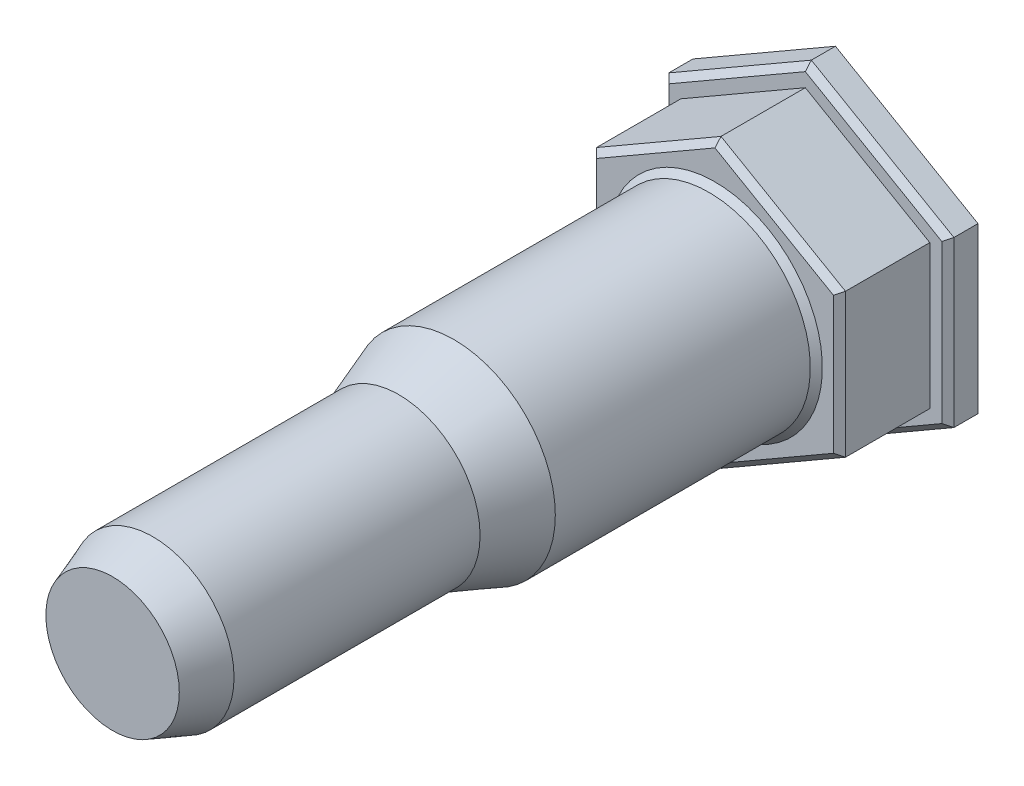
ISO-10303-21;
HEADER;
FILE_DESCRIPTION(('STEP AP214'),'2;1');
FILE_NAME('part.step','',(''),(''),'','','');
FILE_SCHEMA(('AUTOMOTIVE_DESIGN { 1 0 10303 214 1 1 1 1 }'));
ENDSEC;
DATA;
#1=APPLICATION_CONTEXT('core data for automotive mechanical design processes');
#2=APPLICATION_PROTOCOL_DEFINITION('international standard','automotive_design',2000,#1);
#3=PRODUCT_CONTEXT('',#1,'mechanical');
#4=PRODUCT('Part','Part','',(#3));
#5=PRODUCT_RELATED_PRODUCT_CATEGORY('part','',(#4));
#6=PRODUCT_DEFINITION_FORMATION('','',#4);
#7=PRODUCT_DEFINITION_CONTEXT('part definition',#1,'design');
#8=PRODUCT_DEFINITION('design','',#6,#7);
#9=PRODUCT_DEFINITION_SHAPE('','',#8);
#10=(LENGTH_UNIT() NAMED_UNIT(*) SI_UNIT(.MILLI.,.METRE.));
#11=(NAMED_UNIT(*) PLANE_ANGLE_UNIT() SI_UNIT($,.RADIAN.));
#12=(NAMED_UNIT(*) SI_UNIT($,.STERADIAN.) SOLID_ANGLE_UNIT());
#13=UNCERTAINTY_MEASURE_WITH_UNIT(LENGTH_MEASURE(1.E-05),#10,'distance_accuracy_value','');
#14=(GEOMETRIC_REPRESENTATION_CONTEXT(3) GLOBAL_UNCERTAINTY_ASSIGNED_CONTEXT((#13)) GLOBAL_UNIT_ASSIGNED_CONTEXT((#10,
#11,#12)) REPRESENTATION_CONTEXT('',''));
#15=CARTESIAN_POINT('',(0.,0.,0.));
#16=DIRECTION('',(0.,0.,1.));
#17=DIRECTION('',(1.,0.,0.));
#18=AXIS2_PLACEMENT_3D('',#15,#16,#17);
#19=CARTESIAN_POINT('',(-7.1,-4.09918691124635,1.5));
#20=DIRECTION('',(-1.,0.,0.));
#21=DIRECTION('',(0.,0.,1.));
#22=AXIS2_PLACEMENT_3D('',#19,#20,#21);
#23=PLANE('',#22);
#24=DIRECTION('',(0.,0.,-1.));
#25=VECTOR('',#24,1.);
#26=CARTESIAN_POINT('',(-7.1,-4.09918691124635,1.5));
#27=LINE('',#26,#25);
#28=CARTESIAN_POINT('',(-7.1,-4.09918691124635,1.20000000000001));
#29=VERTEX_POINT('',#28);
#30=CARTESIAN_POINT('',(-7.1,-4.09918691124635,0.));
#31=VERTEX_POINT('',#30);
#32=EDGE_CURVE('E248',#29,#31,#27,.T.);
#33=ORIENTED_EDGE('',*,*,#32,.F.);
#34=DIRECTION('',(0.,1.,0.));
#35=VECTOR('',#34,1.);
#36=CARTESIAN_POINT('',(-7.1,4.09918691124634,1.20000000000001));
#37=LINE('',#36,#35);
#38=CARTESIAN_POINT('',(-7.1,4.09918691124634,1.20000000000001));
#39=VERTEX_POINT('',#38);
#40=EDGE_CURVE('E86',#29,#39,#37,.T.);
#41=ORIENTED_EDGE('',*,*,#40,.T.);
#42=DIRECTION('',(0.,0.,-1.));
#43=VECTOR('',#42,1.);
#44=CARTESIAN_POINT('',(-7.1,4.09918691124634,1.5));
#45=LINE('',#44,#43);
#46=CARTESIAN_POINT('',(-7.1,4.09918691124634,0.));
#47=VERTEX_POINT('',#46);
#48=EDGE_CURVE('E247',#39,#47,#45,.T.);
#49=ORIENTED_EDGE('',*,*,#48,.T.);
#50=DIRECTION('',(0.,1.,0.));
#51=VECTOR('',#50,1.);
#52=CARTESIAN_POINT('',(-7.1,-4.09918691124635,0.));
#53=LINE('',#52,#51);
#54=EDGE_CURVE('E229',#31,#47,#53,.T.);
#55=ORIENTED_EDGE('',*,*,#54,.F.);
#56=EDGE_LOOP('',(#33,#41,#49,#55));
#57=FACE_BOUND('',#56,.T.);
#58=ADVANCED_FACE('F62',(#57),#23,.T.);
#59=CARTESIAN_POINT('',(0.,-8.19837382249269,1.5));
#60=DIRECTION('',(-0.5,-0.866025403784439,0.));
#61=DIRECTION('',(0.866025403784439,-0.5,0.));
#62=AXIS2_PLACEMENT_3D('',#59,#60,#61);
#63=PLANE('',#62);
#64=DIRECTION('',(0.,0.,-1.));
#65=VECTOR('',#64,1.);
#66=CARTESIAN_POINT('',(0.,-8.19837382249269,1.5));
#67=LINE('',#66,#65);
#68=CARTESIAN_POINT('',(0.,-8.19837382249269,1.20000000000001));
#69=VERTEX_POINT('',#68);
#70=CARTESIAN_POINT('',(0.,-8.19837382249269,0.));
#71=VERTEX_POINT('',#70);
#72=EDGE_CURVE('E251',#69,#71,#67,.T.);
#73=ORIENTED_EDGE('',*,*,#72,.F.);
#74=DIRECTION('',(-0.866025403784439,0.5,0.));
#75=VECTOR('',#74,1.);
#76=CARTESIAN_POINT('',(-7.1,-4.09918691124635,1.20000000000001));
#77=LINE('',#76,#75);
#78=EDGE_CURVE('E325',#69,#29,#77,.T.);
#79=ORIENTED_EDGE('',*,*,#78,.T.);
#80=ORIENTED_EDGE('',*,*,#32,.T.);
#81=DIRECTION('',(-0.866025403784438,0.5,0.));
#82=VECTOR('',#81,1.);
#83=CARTESIAN_POINT('',(0.,-8.19837382249269,0.));
#84=LINE('',#83,#82);
#85=EDGE_CURVE('E244',#71,#31,#84,.T.);
#86=ORIENTED_EDGE('',*,*,#85,.F.);
#87=EDGE_LOOP('',(#73,#79,#80,#86));
#88=FACE_BOUND('',#87,.T.);
#89=ADVANCED_FACE('F394',(#88),#63,.T.);
#90=CARTESIAN_POINT('',(7.1,-4.09918691124635,1.5));
#91=DIRECTION('',(0.500000000000001,-0.866025403784438,0.));
#92=DIRECTION('',(0.866025403784438,0.500000000000001,0.));
#93=AXIS2_PLACEMENT_3D('',#90,#91,#92);
#94=PLANE('',#93);
#95=DIRECTION('',(0.,0.,-1.));
#96=VECTOR('',#95,1.);
#97=CARTESIAN_POINT('',(7.1,-4.09918691124635,1.5));
#98=LINE('',#97,#96);
#99=CARTESIAN_POINT('',(7.1,-4.09918691124635,1.2));
#100=VERTEX_POINT('',#99);
#101=CARTESIAN_POINT('',(7.1,-4.09918691124635,0.));
#102=VERTEX_POINT('',#101);
#103=EDGE_CURVE('E253',#100,#102,#98,.T.);
#104=ORIENTED_EDGE('',*,*,#103,.F.);
#105=DIRECTION('',(-0.866025403784438,-0.500000000000001,0.));
#106=VECTOR('',#105,1.);
#107=CARTESIAN_POINT('',(0.,-8.19837382249269,1.2));
#108=LINE('',#107,#106);
#109=EDGE_CURVE('E323',#100,#69,#108,.T.);
#110=ORIENTED_EDGE('',*,*,#109,.T.);
#111=ORIENTED_EDGE('',*,*,#72,.T.);
#112=DIRECTION('',(-0.866025403784438,-0.500000000000001,0.));
#113=VECTOR('',#112,1.);
#114=CARTESIAN_POINT('',(7.1,-4.09918691124635,0.));
#115=LINE('',#114,#113);
#116=EDGE_CURVE('E241',#102,#71,#115,.T.);
#117=ORIENTED_EDGE('',*,*,#116,.F.);
#118=EDGE_LOOP('',(#104,#110,#111,#117));
#119=FACE_BOUND('',#118,.T.);
#120=ADVANCED_FACE('F417',(#119),#94,.T.);
#121=CARTESIAN_POINT('',(7.1,4.09918691124634,1.5));
#122=DIRECTION('',(1.,0.,0.));
#123=DIRECTION('',(0.,0.,-1.));
#124=AXIS2_PLACEMENT_3D('',#121,#122,#123);
#125=PLANE('',#124);
#126=DIRECTION('',(0.,0.,-1.));
#127=VECTOR('',#126,1.);
#128=CARTESIAN_POINT('',(7.1,4.09918691124634,1.5));
#129=LINE('',#128,#127);
#130=CARTESIAN_POINT('',(7.1,4.09918691124634,1.20000000000001));
#131=VERTEX_POINT('',#130);
#132=CARTESIAN_POINT('',(7.1,4.09918691124634,0.));
#133=VERTEX_POINT('',#132);
#134=EDGE_CURVE('E255',#131,#133,#129,.T.);
#135=ORIENTED_EDGE('',*,*,#134,.F.);
#136=DIRECTION('',(0.,-1.,0.));
#137=VECTOR('',#136,1.);
#138=CARTESIAN_POINT('',(7.1,-4.09918691124635,1.20000000000001));
#139=LINE('',#138,#137);
#140=EDGE_CURVE('E307',#131,#100,#139,.T.);
#141=ORIENTED_EDGE('',*,*,#140,.T.);
#142=ORIENTED_EDGE('',*,*,#103,.T.);
#143=DIRECTION('',(0.,-1.,0.));
#144=VECTOR('',#143,1.);
#145=CARTESIAN_POINT('',(7.1,4.09918691124634,0.));
#146=LINE('',#145,#144);
#147=EDGE_CURVE('E238',#133,#102,#146,.T.);
#148=ORIENTED_EDGE('',*,*,#147,.F.);
#149=EDGE_LOOP('',(#135,#141,#142,#148));
#150=FACE_BOUND('',#149,.T.);
#151=ADVANCED_FACE('F382',(#150),#125,.T.);
#152=CARTESIAN_POINT('',(0.,8.19837382249269,1.5));
#153=DIRECTION('',(0.5,0.866025403784438,0.));
#154=DIRECTION('',(-0.866025403784439,0.5,0.));
#155=AXIS2_PLACEMENT_3D('',#152,#153,#154);
#156=PLANE('',#155);
#157=DIRECTION('',(0.,0.,-1.));
#158=VECTOR('',#157,1.);
#159=CARTESIAN_POINT('',(0.,8.19837382249269,1.5));
#160=LINE('',#159,#158);
#161=CARTESIAN_POINT('',(0.,8.19837382249269,1.20000000000001));
#162=VERTEX_POINT('',#161);
#163=CARTESIAN_POINT('',(0.,8.19837382249269,0.));
#164=VERTEX_POINT('',#163);
#165=EDGE_CURVE('E257',#162,#164,#160,.T.);
#166=ORIENTED_EDGE('',*,*,#165,.F.);
#167=DIRECTION('',(0.866025403784439,-0.5,0.));
#168=VECTOR('',#167,1.);
#169=CARTESIAN_POINT('',(7.1,4.09918691124634,1.20000000000001));
#170=LINE('',#169,#168);
#171=EDGE_CURVE('E72',#162,#131,#170,.T.);
#172=ORIENTED_EDGE('',*,*,#171,.T.);
#173=ORIENTED_EDGE('',*,*,#134,.T.);
#174=DIRECTION('',(0.866025403784439,-0.5,0.));
#175=VECTOR('',#174,1.);
#176=CARTESIAN_POINT('',(0.,8.19837382249269,0.));
#177=LINE('',#176,#175);
#178=EDGE_CURVE('E235',#164,#133,#177,.T.);
#179=ORIENTED_EDGE('',*,*,#178,.F.);
#180=EDGE_LOOP('',(#166,#172,#173,#179));
#181=FACE_BOUND('',#180,.T.);
#182=ADVANCED_FACE('F378',(#181),#156,.T.);
#183=CARTESIAN_POINT('',(-7.1,4.09918691124634,1.5));
#184=DIRECTION('',(-0.500000000000001,0.866025403784438,0.));
#185=DIRECTION('',(-0.866025403784438,-0.500000000000001,0.));
#186=AXIS2_PLACEMENT_3D('',#183,#184,#185);
#187=PLANE('',#186);
#188=ORIENTED_EDGE('',*,*,#48,.F.);
#189=DIRECTION('',(0.866025403784438,0.500000000000001,0.));
#190=VECTOR('',#189,1.);
#191=CARTESIAN_POINT('',(0.,8.19837382249269,1.20000000000001));
#192=LINE('',#191,#190);
#193=EDGE_CURVE('E12',#39,#162,#192,.T.);
#194=ORIENTED_EDGE('',*,*,#193,.T.);
#195=ORIENTED_EDGE('',*,*,#165,.T.);
#196=DIRECTION('',(0.866025403784438,0.5,0.));
#197=VECTOR('',#196,1.);
#198=CARTESIAN_POINT('',(-7.1,4.09918691124634,0.));
#199=LINE('',#198,#197);
#200=EDGE_CURVE('E232',#47,#164,#199,.T.);
#201=ORIENTED_EDGE('',*,*,#200,.F.);
#202=EDGE_LOOP('',(#188,#194,#195,#201));
#203=FACE_BOUND('',#202,.T.);
#204=ADVANCED_FACE('F390',(#203),#187,.T.);
#205=CARTESIAN_POINT('',(0.,0.,1.5));
#206=DIRECTION('',(0.,0.,-1.));
#207=DIRECTION('',(-1.,0.,0.));
#208=AXIS2_PLACEMENT_3D('',#205,#206,#207);
#209=PLANE('',#208);
#210=DIRECTION('',(0.866025403784438,0.500000000000001,0.));
#211=VECTOR('',#210,1.);
#212=CARTESIAN_POINT('',(6.95,-3.83937929011101,1.5));
#213=LINE('',#212,#211);
#214=CARTESIAN_POINT('',(0.,-7.85196366097892,1.5));
#215=VERTEX_POINT('',#214);
#216=CARTESIAN_POINT('',(6.8,-3.92598183048946,1.5));
#217=VERTEX_POINT('',#216);
#218=EDGE_CURVE('E318',#215,#217,#213,.T.);
#219=ORIENTED_EDGE('',*,*,#218,.T.);
#220=DIRECTION('',(0.,1.,0.));
#221=VECTOR('',#220,1.);
#222=CARTESIAN_POINT('',(6.8,4.09918691124634,1.5));
#223=LINE('',#222,#221);
#224=CARTESIAN_POINT('',(6.8,3.92598183048945,1.5));
#225=VERTEX_POINT('',#224);
#226=EDGE_CURVE('E320',#217,#225,#223,.T.);
#227=ORIENTED_EDGE('',*,*,#226,.T.);
#228=DIRECTION('',(-0.866025403784439,0.5,0.));
#229=VECTOR('',#228,1.);
#230=CARTESIAN_POINT('',(-0.150000000000002,7.93856620135735,1.5));
#231=LINE('',#230,#229);
#232=CARTESIAN_POINT('',(0.,7.85196366097891,1.5));
#233=VERTEX_POINT('',#232);
#234=EDGE_CURVE('E312',#225,#233,#231,.T.);
#235=ORIENTED_EDGE('',*,*,#234,.T.);
#236=DIRECTION('',(-0.866025403784438,-0.5,0.));
#237=VECTOR('',#236,1.);
#238=CARTESIAN_POINT('',(-6.95,3.83937929011101,1.5));
#239=LINE('',#238,#237);
#240=CARTESIAN_POINT('',(-6.8,3.92598183048945,1.5));
#241=VERTEX_POINT('',#240);
#242=EDGE_CURVE('E310',#233,#241,#239,.T.);
#243=ORIENTED_EDGE('',*,*,#242,.T.);
#244=DIRECTION('',(0.,-1.,0.));
#245=VECTOR('',#244,1.);
#246=CARTESIAN_POINT('',(-6.8,-4.09918691124635,1.5));
#247=LINE('',#246,#245);
#248=CARTESIAN_POINT('',(-6.8,-3.92598183048946,1.5));
#249=VERTEX_POINT('',#248);
#250=EDGE_CURVE('E314',#241,#249,#247,.T.);
#251=ORIENTED_EDGE('',*,*,#250,.T.);
#252=DIRECTION('',(0.866025403784439,-0.5,0.));
#253=VECTOR('',#252,1.);
#254=CARTESIAN_POINT('',(0.150000000000004,-7.93856620135736,1.5));
#255=LINE('',#254,#253);
#256=EDGE_CURVE('E316',#249,#215,#255,.T.);
#257=ORIENTED_EDGE('',*,*,#256,.T.);
#258=EDGE_LOOP('',(#219,#227,#235,#243,#251,#257));
#259=FACE_BOUND('',#258,.T.);
#260=DIRECTION('',(-0.866025403784438,-0.500000000000001,0.));
#261=VECTOR('',#260,1.);
#262=CARTESIAN_POINT('',(3.1,-5.36935750346352,1.5));
#263=LINE('',#262,#261);
#264=CARTESIAN_POINT('',(6.2,-3.57957166897568,1.5));
#265=VERTEX_POINT('',#264);
#266=CARTESIAN_POINT('',(0.,-7.15914333795136,1.5));
#267=VERTEX_POINT('',#266);
#268=EDGE_CURVE('E217',#265,#267,#263,.T.);
#269=ORIENTED_EDGE('',*,*,#268,.T.);
#270=DIRECTION('',(-0.866025403784439,0.5,0.));
#271=VECTOR('',#270,1.);
#272=CARTESIAN_POINT('',(-3.1,-5.36935750346352,1.5));
#273=LINE('',#272,#271);
#274=CARTESIAN_POINT('',(-6.2,-3.57957166897568,1.5));
#275=VERTEX_POINT('',#274);
#276=EDGE_CURVE('E194',#267,#275,#273,.T.);
#277=ORIENTED_EDGE('',*,*,#276,.T.);
#278=DIRECTION('',(0.,1.,0.));
#279=VECTOR('',#278,1.);
#280=CARTESIAN_POINT('',(-6.2,0.,1.5));
#281=LINE('',#280,#279);
#282=CARTESIAN_POINT('',(-6.2,3.57957166897568,1.5));
#283=VERTEX_POINT('',#282);
#284=EDGE_CURVE('E205',#275,#283,#281,.T.);
#285=ORIENTED_EDGE('',*,*,#284,.T.);
#286=DIRECTION('',(0.866025403784438,0.500000000000001,0.));
#287=VECTOR('',#286,1.);
#288=CARTESIAN_POINT('',(-3.1,5.36935750346352,1.5));
#289=LINE('',#288,#287);
#290=CARTESIAN_POINT('',(0.,7.15914333795136,1.5));
#291=VERTEX_POINT('',#290);
#292=EDGE_CURVE('E211',#283,#291,#289,.T.);
#293=ORIENTED_EDGE('',*,*,#292,.T.);
#294=DIRECTION('',(0.866025403784439,-0.5,0.));
#295=VECTOR('',#294,1.);
#296=CARTESIAN_POINT('',(3.1,5.36935750346352,1.5));
#297=LINE('',#296,#295);
#298=CARTESIAN_POINT('',(6.2,3.57957166897568,1.5));
#299=VERTEX_POINT('',#298);
#300=EDGE_CURVE('E532',#291,#299,#297,.T.);
#301=ORIENTED_EDGE('',*,*,#300,.T.);
#302=DIRECTION('',(0.,-1.,0.));
#303=VECTOR('',#302,1.);
#304=CARTESIAN_POINT('',(6.2,0.,1.5));
#305=LINE('',#304,#303);
#306=EDGE_CURVE('E223',#299,#265,#305,.T.);
#307=ORIENTED_EDGE('',*,*,#306,.T.);
#308=EDGE_LOOP('',(#269,#277,#285,#293,#301,#307));
#309=FACE_BOUND('',#308,.T.);
#310=ADVANCED_FACE('F214',(#259,#309),#209,.F.);
#311=CARTESIAN_POINT('',(0.,0.,0.));
#312=DIRECTION('',(0.,0.,-1.));
#313=DIRECTION('',(-1.,0.,0.));
#314=AXIS2_PLACEMENT_3D('',#311,#312,#313);
#315=PLANE('',#314);
#316=ORIENTED_EDGE('',*,*,#54,.T.);
#317=ORIENTED_EDGE('',*,*,#200,.T.);
#318=ORIENTED_EDGE('',*,*,#178,.T.);
#319=ORIENTED_EDGE('',*,*,#147,.T.);
#320=ORIENTED_EDGE('',*,*,#116,.T.);
#321=ORIENTED_EDGE('',*,*,#85,.T.);
#322=EDGE_LOOP('',(#316,#317,#318,#319,#320,#321));
#323=FACE_BOUND('',#322,.T.);
#324=CARTESIAN_POINT('',(0.,0.,0.));
#325=DIRECTION('',(0.,0.,1.));
#326=DIRECTION('',(1.,0.,0.));
#327=AXIS2_PLACEMENT_3D('',#324,#325,#326);
#328=CIRCLE('',#327,3.05);
#329=CARTESIAN_POINT('',(3.05,0.,0.));
#330=VERTEX_POINT('',#329);
#331=EDGE_CURVE('E218',#330,#330,#328,.T.);
#332=ORIENTED_EDGE('',*,*,#331,.T.);
#333=EDGE_LOOP('',(#332));
#334=FACE_BOUND('',#333,.T.);
#335=ADVANCED_FACE('F386',(#323,#334),#315,.T.);
#336=CARTESIAN_POINT('',(0.,0.,19.));
#337=DIRECTION('',(0.,0.,-1.));
#338=DIRECTION('',(-1.,0.,0.));
#339=AXIS2_PLACEMENT_3D('',#336,#337,#338);
#340=CYLINDRICAL_SURFACE('',#339,3.05);
#341=CARTESIAN_POINT('',(0.,0.,17.0226497308104));
#342=DIRECTION('',(0.,0.,-1.));
#343=DIRECTION('',(-1.,0.,0.));
#344=AXIS2_PLACEMENT_3D('',#341,#342,#343);
#345=CIRCLE('',#344,3.05);
#346=CARTESIAN_POINT('',(-3.05,0.,17.0226497308104));
#347=VERTEX_POINT('',#346);
#348=EDGE_CURVE('E274',#347,#347,#345,.F.);
#349=ORIENTED_EDGE('',*,*,#348,.T.);
#350=EDGE_LOOP('',(#349));
#351=FACE_BOUND('',#350,.T.);
#352=ORIENTED_EDGE('',*,*,#331,.F.);
#353=EDGE_LOOP('',(#352));
#354=FACE_BOUND('',#353,.T.);
#355=ADVANCED_FACE('F422',(#351,#354),#340,.F.);
#356=CARTESIAN_POINT('',(0.,0.,34.));
#357=DIRECTION('',(0.,0.,1.));
#358=DIRECTION('',(1.,0.,0.));
#359=AXIS2_PLACEMENT_3D('',#356,#357,#358);
#360=PLANE('',#359);
#361=CARTESIAN_POINT('',(0.,0.,34.));
#362=DIRECTION('',(0.,0.,1.));
#363=DIRECTION('',(1.,0.,0.));
#364=AXIS2_PLACEMENT_3D('',#361,#362,#363);
#365=CIRCLE('',#364,2.05);
#366=CARTESIAN_POINT('',(2.05,0.,34.));
#367=VERTEX_POINT('',#366);
#368=EDGE_CURVE('E250',#367,#367,#365,.T.);
#369=ORIENTED_EDGE('',*,*,#368,.F.);
#370=EDGE_LOOP('',(#369));
#371=FACE_BOUND('',#370,.T.);
#372=ADVANCED_FACE('F425',(#371),#360,.F.);
#373=CARTESIAN_POINT('',(0.,0.,36.));
#374=DIRECTION('',(0.,0.,-1.));
#375=DIRECTION('',(-1.,0.,0.));
#376=AXIS2_PLACEMENT_3D('',#373,#374,#375);
#377=CYLINDRICAL_SURFACE('',#376,2.05);
#378=CARTESIAN_POINT('',(0.,0.,17.6));
#379=DIRECTION('',(0.,0.,1.));
#380=DIRECTION('',(1.,0.,0.));
#381=AXIS2_PLACEMENT_3D('',#378,#379,#380);
#382=CIRCLE('',#381,2.05);
#383=CARTESIAN_POINT('',(2.05,0.,17.6));
#384=VERTEX_POINT('',#383);
#385=EDGE_CURVE('E271',#384,#384,#382,.F.);
#386=ORIENTED_EDGE('',*,*,#385,.T.);
#387=EDGE_LOOP('',(#386));
#388=FACE_BOUND('',#387,.T.);
#389=ORIENTED_EDGE('',*,*,#368,.T.);
#390=EDGE_LOOP('',(#389));
#391=FACE_BOUND('',#390,.T.);
#392=ADVANCED_FACE('F429',(#388,#391),#377,.F.);
#393=CARTESIAN_POINT('',(0.,-7.15914333795136,6.));
#394=DIRECTION('',(-0.5,-0.866025403784438,0.));
#395=DIRECTION('',(0.866025403784439,-0.5,0.));
#396=AXIS2_PLACEMENT_3D('',#393,#394,#395);
#397=PLANE('',#396);
#398=DIRECTION('',(0.,0.,-1.));
#399=VECTOR('',#398,1.);
#400=CARTESIAN_POINT('',(0.,-7.15914333795136,6.));
#401=LINE('',#400,#399);
#402=CARTESIAN_POINT('',(0.,-7.15914333795136,5.69999999999999));
#403=VERTEX_POINT('',#402);
#404=EDGE_CURVE('E212',#403,#267,#401,.T.);
#405=ORIENTED_EDGE('',*,*,#404,.F.);
#406=DIRECTION('',(-0.866025403784439,0.5,0.));
#407=VECTOR('',#406,1.);
#408=CARTESIAN_POINT('',(-6.2,-3.57957166897568,5.69999999999999));
#409=LINE('',#408,#407);
#410=CARTESIAN_POINT('',(-6.2,-3.57957166897568,5.69999999999999));
#411=VERTEX_POINT('',#410);
#412=EDGE_CURVE('E197',#403,#411,#409,.T.);
#413=ORIENTED_EDGE('',*,*,#412,.T.);
#414=DIRECTION('',(0.,0.,-1.));
#415=VECTOR('',#414,1.);
#416=CARTESIAN_POINT('',(-6.2,-3.57957166897568,6.));
#417=LINE('',#416,#415);
#418=EDGE_CURVE('E189',#411,#275,#417,.T.);
#419=ORIENTED_EDGE('',*,*,#418,.T.);
#420=ORIENTED_EDGE('',*,*,#276,.F.);
#421=EDGE_LOOP('',(#405,#413,#419,#420));
#422=FACE_BOUND('',#421,.T.);
#423=ADVANCED_FACE('F192',(#422),#397,.T.);
#424=CARTESIAN_POINT('',(6.2,-3.57957166897568,6.));
#425=DIRECTION('',(0.500000000000001,-0.866025403784438,0.));
#426=DIRECTION('',(0.866025403784438,0.500000000000001,0.));
#427=AXIS2_PLACEMENT_3D('',#424,#425,#426);
#428=PLANE('',#427);
#429=DIRECTION('',(0.,0.,-1.));
#430=VECTOR('',#429,1.);
#431=CARTESIAN_POINT('',(6.2,-3.57957166897568,6.));
#432=LINE('',#431,#430);
#433=CARTESIAN_POINT('',(6.2,-3.57957166897568,5.69999999999999));
#434=VERTEX_POINT('',#433);
#435=EDGE_CURVE('E540',#434,#265,#432,.T.);
#436=ORIENTED_EDGE('',*,*,#435,.F.);
#437=DIRECTION('',(-0.866025403784438,-0.500000000000001,0.));
#438=VECTOR('',#437,1.);
#439=CARTESIAN_POINT('',(0.,-7.15914333795136,5.69999999999999));
#440=LINE('',#439,#438);
#441=EDGE_CURVE('E304',#434,#403,#440,.T.);
#442=ORIENTED_EDGE('',*,*,#441,.T.);
#443=ORIENTED_EDGE('',*,*,#404,.T.);
#444=ORIENTED_EDGE('',*,*,#268,.F.);
#445=EDGE_LOOP('',(#436,#442,#443,#444));
#446=FACE_BOUND('',#445,.T.);
#447=ADVANCED_FACE('F543',(#446),#428,.T.);
#448=CARTESIAN_POINT('',(6.2,3.57957166897568,6.));
#449=DIRECTION('',(1.,0.,0.));
#450=DIRECTION('',(0.,1.,0.));
#451=AXIS2_PLACEMENT_3D('',#448,#449,#450);
#452=PLANE('',#451);
#453=DIRECTION('',(0.,0.,-1.));
#454=VECTOR('',#453,1.);
#455=CARTESIAN_POINT('',(6.2,3.57957166897568,6.));
#456=LINE('',#455,#454);
#457=CARTESIAN_POINT('',(6.2,3.57957166897568,5.69999999999999));
#458=VERTEX_POINT('',#457);
#459=EDGE_CURVE('E527',#458,#299,#456,.T.);
#460=ORIENTED_EDGE('',*,*,#459,.F.);
#461=DIRECTION('',(0.,-1.,0.));
#462=VECTOR('',#461,1.);
#463=CARTESIAN_POINT('',(6.2,-3.57957166897568,5.69999999999999));
#464=LINE('',#463,#462);
#465=EDGE_CURVE('E302',#458,#434,#464,.T.);
#466=ORIENTED_EDGE('',*,*,#465,.T.);
#467=ORIENTED_EDGE('',*,*,#435,.T.);
#468=ORIENTED_EDGE('',*,*,#306,.F.);
#469=EDGE_LOOP('',(#460,#466,#467,#468));
#470=FACE_BOUND('',#469,.T.);
#471=ADVANCED_FACE('F538',(#470),#452,.T.);
#472=CARTESIAN_POINT('',(0.,7.15914333795136,6.));
#473=DIRECTION('',(0.5,0.866025403784439,0.));
#474=DIRECTION('',(-0.866025403784439,0.5,0.));
#475=AXIS2_PLACEMENT_3D('',#472,#473,#474);
#476=PLANE('',#475);
#477=DIRECTION('',(0.,0.,-1.));
#478=VECTOR('',#477,1.);
#479=CARTESIAN_POINT('',(0.,7.15914333795136,6.));
#480=LINE('',#479,#478);
#481=CARTESIAN_POINT('',(0.,7.15914333795136,5.69999999999999));
#482=VERTEX_POINT('',#481);
#483=EDGE_CURVE('E525',#482,#291,#480,.T.);
#484=ORIENTED_EDGE('',*,*,#483,.F.);
#485=DIRECTION('',(0.866025403784439,-0.5,0.));
#486=VECTOR('',#485,1.);
#487=CARTESIAN_POINT('',(6.2,3.57957166897568,5.69999999999999));
#488=LINE('',#487,#486);
#489=EDGE_CURVE('E300',#482,#458,#488,.T.);
#490=ORIENTED_EDGE('',*,*,#489,.T.);
#491=ORIENTED_EDGE('',*,*,#459,.T.);
#492=ORIENTED_EDGE('',*,*,#300,.F.);
#493=EDGE_LOOP('',(#484,#490,#491,#492));
#494=FACE_BOUND('',#493,.T.);
#495=ADVANCED_FACE('F546',(#494),#476,.T.);
#496=CARTESIAN_POINT('',(-6.2,3.57957166897568,6.));
#497=DIRECTION('',(-0.5,0.866025403784438,0.));
#498=DIRECTION('',(-0.866025403784438,-0.500000000000001,0.));
#499=AXIS2_PLACEMENT_3D('',#496,#497,#498);
#500=PLANE('',#499);
#501=DIRECTION('',(0.,0.,-1.));
#502=VECTOR('',#501,1.);
#503=CARTESIAN_POINT('',(-6.2,3.57957166897568,6.));
#504=LINE('',#503,#502);
#505=CARTESIAN_POINT('',(-6.2,3.57957166897568,5.7));
#506=VERTEX_POINT('',#505);
#507=EDGE_CURVE('E201',#506,#283,#504,.T.);
#508=ORIENTED_EDGE('',*,*,#507,.F.);
#509=DIRECTION('',(0.866025403784438,0.500000000000001,0.));
#510=VECTOR('',#509,1.);
#511=CARTESIAN_POINT('',(0.,7.15914333795136,5.7));
#512=LINE('',#511,#510);
#513=EDGE_CURVE('E298',#506,#482,#512,.T.);
#514=ORIENTED_EDGE('',*,*,#513,.T.);
#515=ORIENTED_EDGE('',*,*,#483,.T.);
#516=ORIENTED_EDGE('',*,*,#292,.F.);
#517=EDGE_LOOP('',(#508,#514,#515,#516));
#518=FACE_BOUND('',#517,.T.);
#519=ADVANCED_FACE('F523',(#518),#500,.T.);
#520=CARTESIAN_POINT('',(-6.2,-3.57957166897568,6.));
#521=DIRECTION('',(-1.,0.,0.));
#522=DIRECTION('',(0.,-1.,0.));
#523=AXIS2_PLACEMENT_3D('',#520,#521,#522);
#524=PLANE('',#523);
#525=ORIENTED_EDGE('',*,*,#418,.F.);
#526=DIRECTION('',(0.,1.,0.));
#527=VECTOR('',#526,1.);
#528=CARTESIAN_POINT('',(-6.2,3.57957166897568,5.69999999999999));
#529=LINE('',#528,#527);
#530=EDGE_CURVE('E296',#411,#506,#529,.T.);
#531=ORIENTED_EDGE('',*,*,#530,.T.);
#532=ORIENTED_EDGE('',*,*,#507,.T.);
#533=ORIENTED_EDGE('',*,*,#284,.F.);
#534=EDGE_LOOP('',(#525,#531,#532,#533));
#535=FACE_BOUND('',#534,.T.);
#536=ADVANCED_FACE('F206',(#535),#524,.T.);
#537=CARTESIAN_POINT('',(0.,0.,6.));
#538=DIRECTION('',(0.,0.,-1.));
#539=DIRECTION('',(-1.,0.,0.));
#540=AXIS2_PLACEMENT_3D('',#537,#538,#539);
#541=PLANE('',#540);
#542=CARTESIAN_POINT('',(0.,0.,6.));
#543=DIRECTION('',(0.,0.,-1.));
#544=DIRECTION('',(-1.,0.,0.));
#545=AXIS2_PLACEMENT_3D('',#542,#543,#544);
#546=CIRCLE('',#545,5.35000000000001);
#547=CARTESIAN_POINT('',(-5.35000000000001,0.,6.));
#548=VERTEX_POINT('',#547);
#549=EDGE_CURVE('E290',#548,#548,#546,.T.);
#550=ORIENTED_EDGE('',*,*,#549,.T.);
#551=EDGE_LOOP('',(#550));
#552=FACE_BOUND('',#551,.T.);
#553=DIRECTION('',(-0.866025403784438,-0.500000000000001,0.));
#554=VECTOR('',#553,1.);
#555=CARTESIAN_POINT('',(-6.05,3.31976404784034,6.));
#556=LINE('',#555,#554);
#557=CARTESIAN_POINT('',(0.,6.81273317643758,6.));
#558=VERTEX_POINT('',#557);
#559=CARTESIAN_POINT('',(-5.9,3.40636658821879,6.));
#560=VERTEX_POINT('',#559);
#561=EDGE_CURVE('E285',#558,#560,#556,.T.);
#562=ORIENTED_EDGE('',*,*,#561,.T.);
#563=DIRECTION('',(0.,-1.,0.));
#564=VECTOR('',#563,1.);
#565=CARTESIAN_POINT('',(-5.9,-3.57957166897568,6.));
#566=LINE('',#565,#564);
#567=CARTESIAN_POINT('',(-5.9,-3.40636658821879,6.));
#568=VERTEX_POINT('',#567);
#569=EDGE_CURVE('E287',#560,#568,#566,.T.);
#570=ORIENTED_EDGE('',*,*,#569,.T.);
#571=DIRECTION('',(0.866025403784439,-0.5,0.));
#572=VECTOR('',#571,1.);
#573=CARTESIAN_POINT('',(0.150000000000006,-6.89933571681603,6.));
#574=LINE('',#573,#572);
#575=CARTESIAN_POINT('',(0.,-6.81273317643758,6.));
#576=VERTEX_POINT('',#575);
#577=EDGE_CURVE('E277',#568,#576,#574,.T.);
#578=ORIENTED_EDGE('',*,*,#577,.T.);
#579=DIRECTION('',(0.866025403784438,0.500000000000001,0.));
#580=VECTOR('',#579,1.);
#581=CARTESIAN_POINT('',(6.05,-3.31976404784035,6.));
#582=LINE('',#581,#580);
#583=CARTESIAN_POINT('',(5.9,-3.40636658821879,6.));
#584=VERTEX_POINT('',#583);
#585=EDGE_CURVE('E279',#576,#584,#582,.T.);
#586=ORIENTED_EDGE('',*,*,#585,.T.);
#587=DIRECTION('',(0.,1.,0.));
#588=VECTOR('',#587,1.);
#589=CARTESIAN_POINT('',(5.89999999999999,3.57957166897568,6.));
#590=LINE('',#589,#588);
#591=CARTESIAN_POINT('',(5.89999999999999,3.40636658821879,6.));
#592=VERTEX_POINT('',#591);
#593=EDGE_CURVE('E281',#584,#592,#590,.T.);
#594=ORIENTED_EDGE('',*,*,#593,.T.);
#595=DIRECTION('',(-0.866025403784439,0.5,0.));
#596=VECTOR('',#595,1.);
#597=CARTESIAN_POINT('',(-0.150000000000004,6.89933571681602,6.));
#598=LINE('',#597,#596);
#599=EDGE_CURVE('E283',#592,#558,#598,.T.);
#600=ORIENTED_EDGE('',*,*,#599,.T.);
#601=EDGE_LOOP('',(#562,#570,#578,#586,#594,#600));
#602=FACE_BOUND('',#601,.T.);
#603=ADVANCED_FACE('F513',(#552,#602),#541,.F.);
#604=CARTESIAN_POINT('',(0.,0.,36.));
#605=DIRECTION('',(0.,0.,1.));
#606=DIRECTION('',(1.,0.,0.));
#607=AXIS2_PLACEMENT_3D('',#604,#605,#606);
#608=PLANE('',#607);
#609=CARTESIAN_POINT('',(0.,0.,36.));
#610=DIRECTION('',(0.,0.,1.));
#611=DIRECTION('',(1.,0.,0.));
#612=AXIS2_PLACEMENT_3D('',#609,#610,#611);
#613=CIRCLE('',#612,3.32205953146759);
#614=CARTESIAN_POINT('',(3.32205953146759,0.,36.));
#615=VERTEX_POINT('',#614);
#616=EDGE_CURVE('E262',#615,#615,#613,.T.);
#617=ORIENTED_EDGE('',*,*,#616,.T.);
#618=EDGE_LOOP('',(#617));
#619=FACE_BOUND('',#618,.T.);
#620=ADVANCED_FACE('F565',(#619),#608,.T.);
#621=CARTESIAN_POINT('',(0.,0.,36.));
#622=DIRECTION('',(0.,0.,-1.));
#623=DIRECTION('',(-1.,0.,0.));
#624=AXIS2_PLACEMENT_3D('',#621,#622,#623);
#625=CYLINDRICAL_SURFACE('',#624,4.05);
#626=CARTESIAN_POINT('',(0.,0.,21.7474774194547));
#627=DIRECTION('',(0.,0.,1.));
#628=DIRECTION('',(1.,0.,0.));
#629=AXIS2_PLACEMENT_3D('',#626,#627,#628);
#630=CIRCLE('',#629,4.05);
#631=CARTESIAN_POINT('',(4.05,0.,21.7474774194547));
#632=VERTEX_POINT('',#631);
#633=EDGE_CURVE('E268',#632,#632,#630,.T.);
#634=ORIENTED_EDGE('',*,*,#633,.T.);
#635=EDGE_LOOP('',(#634));
#636=FACE_BOUND('',#635,.T.);
#637=CARTESIAN_POINT('',(0.,0.,34.));
#638=DIRECTION('',(0.,0.,1.));
#639=DIRECTION('',(1.,0.,0.));
#640=AXIS2_PLACEMENT_3D('',#637,#638,#639);
#641=CIRCLE('',#640,4.05);
#642=CARTESIAN_POINT('',(4.05,0.,34.));
#643=VERTEX_POINT('',#642);
#644=EDGE_CURVE('E265',#643,#643,#641,.F.);
#645=ORIENTED_EDGE('',*,*,#644,.T.);
#646=EDGE_LOOP('',(#645));
#647=FACE_BOUND('',#646,.T.);
#648=ADVANCED_FACE('F563',(#636,#647),#625,.T.);
#649=CARTESIAN_POINT('',(0.,0.,19.));
#650=DIRECTION('',(0.,0.,-1.));
#651=DIRECTION('',(-1.,0.,0.));
#652=AXIS2_PLACEMENT_3D('',#649,#650,#651);
#653=CYLINDRICAL_SURFACE('',#652,5.05);
#654=CARTESIAN_POINT('',(0.,0.,6.30000000000001));
#655=DIRECTION('',(0.,0.,-1.));
#656=DIRECTION('',(-1.,0.,0.));
#657=AXIS2_PLACEMENT_3D('',#654,#655,#656);
#658=CIRCLE('',#657,5.05);
#659=CARTESIAN_POINT('',(-5.05,0.,6.30000000000001));
#660=VERTEX_POINT('',#659);
#661=EDGE_CURVE('E293',#660,#660,#658,.F.);
#662=ORIENTED_EDGE('',*,*,#661,.T.);
#663=EDGE_LOOP('',(#662));
#664=FACE_BOUND('',#663,.T.);
#665=CARTESIAN_POINT('',(0.,0.,19.));
#666=DIRECTION('',(0.,0.,1.));
#667=DIRECTION('',(1.,0.,0.));
#668=AXIS2_PLACEMENT_3D('',#665,#666,#667);
#669=CIRCLE('',#668,5.05);
#670=CARTESIAN_POINT('',(5.05,0.,19.));
#671=VERTEX_POINT('',#670);
#672=EDGE_CURVE('E221',#671,#671,#669,.T.);
#673=ORIENTED_EDGE('',*,*,#672,.F.);
#674=EDGE_LOOP('',(#673));
#675=FACE_BOUND('',#674,.T.);
#676=ADVANCED_FACE('F442',(#664,#675),#653,.T.);
#677=CARTESIAN_POINT('',(0.,0.,36.));
#678=DIRECTION('',(0.,0.,-1.));
#679=DIRECTION('',(-1.,0.,0.));
#680=AXIS2_PLACEMENT_3D('',#677,#678,#679);
#681=CONICAL_SURFACE('',#680,3.32205953146759,0.349065850398863);
#682=ORIENTED_EDGE('',*,*,#644,.F.);
#683=EDGE_LOOP('',(#682));
#684=FACE_BOUND('',#683,.T.);
#685=ORIENTED_EDGE('',*,*,#616,.F.);
#686=EDGE_LOOP('',(#685));
#687=FACE_BOUND('',#686,.T.);
#688=ADVANCED_FACE('F435',(#684,#687),#681,.T.);
#689=CARTESIAN_POINT('',(0.,0.,21.7474774194547));
#690=DIRECTION('',(0.,0.,-1.));
#691=DIRECTION('',(-1.,0.,0.));
#692=AXIS2_PLACEMENT_3D('',#689,#690,#691);
#693=CONICAL_SURFACE('',#692,4.05,0.349065850398861);
#694=ORIENTED_EDGE('',*,*,#672,.T.);
#695=EDGE_LOOP('',(#694));
#696=FACE_BOUND('',#695,.T.);
#697=ORIENTED_EDGE('',*,*,#633,.F.);
#698=EDGE_LOOP('',(#697));
#699=FACE_BOUND('',#698,.T.);
#700=ADVANCED_FACE('F441',(#696,#699),#693,.T.);
#701=CARTESIAN_POINT('',(0.,0.,17.));
#702=DIRECTION('',(0.,0.,-1.));
#703=DIRECTION('',(-1.,0.,0.));
#704=AXIS2_PLACEMENT_3D('',#701,#702,#703);
#705=CONICAL_SURFACE('',#704,3.08923048454135,1.0471975511966);
#706=ORIENTED_EDGE('',*,*,#385,.F.);
#707=EDGE_LOOP('',(#706));
#708=FACE_BOUND('',#707,.T.);
#709=ORIENTED_EDGE('',*,*,#348,.F.);
#710=EDGE_LOOP('',(#709));
#711=FACE_BOUND('',#710,.T.);
#712=ADVANCED_FACE('F449',(#708,#711),#705,.F.);
#713=CARTESIAN_POINT('',(0.,0.,6.));
#714=DIRECTION('',(0.,0.,-1.));
#715=DIRECTION('',(-1.,0.,0.));
#716=AXIS2_PLACEMENT_3D('',#713,#714,#715);
#717=CONICAL_SURFACE('',#716,5.35000000000001,0.785398163397453);
#718=ORIENTED_EDGE('',*,*,#661,.F.);
#719=EDGE_LOOP('',(#718));
#720=FACE_BOUND('',#719,.T.);
#721=ORIENTED_EDGE('',*,*,#549,.F.);
#722=EDGE_LOOP('',(#721));
#723=FACE_BOUND('',#722,.T.);
#724=ADVANCED_FACE('F455',(#720,#723),#717,.T.);
#725=CARTESIAN_POINT('',(6.2,3.57957166897568,5.69999999999999));
#726=DIRECTION('',(0.70710678118655,0.,0.707106781186546));
#727=DIRECTION('',(0.,1.,0.));
#728=AXIS2_PLACEMENT_3D('',#725,#726,#727);
#729=PLANE('',#728);
#730=DIRECTION('',(-0.654653670707975,-0.377964473009229,0.654653670707979));
#731=VECTOR('',#730,1.);
#732=CARTESIAN_POINT('',(6.2,3.57957166897568,5.69999999999999));
#733=LINE('',#732,#731);
#734=EDGE_CURVE('E339',#592,#458,#733,.F.);
#735=ORIENTED_EDGE('',*,*,#734,.F.);
#736=ORIENTED_EDGE('',*,*,#593,.F.);
#737=DIRECTION('',(-0.654653670707976,0.377964473009224,0.65465367070798));
#738=VECTOR('',#737,1.);
#739=CARTESIAN_POINT('',(6.2,-3.57957166897568,5.69999999999999));
#740=LINE('',#739,#738);
#741=EDGE_CURVE('E202',#434,#584,#740,.T.);
#742=ORIENTED_EDGE('',*,*,#741,.F.);
#743=ORIENTED_EDGE('',*,*,#465,.F.);
#744=EDGE_LOOP('',(#735,#736,#742,#743));
#745=FACE_BOUND('',#744,.T.);
#746=ADVANCED_FACE('F462',(#745),#729,.T.);
#747=CARTESIAN_POINT('',(6.2,-3.57957166897568,5.69999999999999));
#748=DIRECTION('',(0.353553390593276,-0.612372435695797,0.707106781186544));
#749=DIRECTION('',(0.866025403784438,0.500000000000001,0.));
#750=AXIS2_PLACEMENT_3D('',#747,#748,#749);
#751=PLANE('',#750);
#752=ORIENTED_EDGE('',*,*,#741,.T.);
#753=ORIENTED_EDGE('',*,*,#585,.F.);
#754=DIRECTION('',(0.,0.755928946018453,0.654653670707979));
#755=VECTOR('',#754,1.);
#756=CARTESIAN_POINT('',(0.,-7.15914333795136,5.69999999999999));
#757=LINE('',#756,#755);
#758=EDGE_CURVE('E336',#403,#576,#757,.T.);
#759=ORIENTED_EDGE('',*,*,#758,.F.);
#760=ORIENTED_EDGE('',*,*,#441,.F.);
#761=EDGE_LOOP('',(#752,#753,#759,#760));
#762=FACE_BOUND('',#761,.T.);
#763=ADVANCED_FACE('F492',(#762),#751,.T.);
#764=CARTESIAN_POINT('',(0.,7.15914333795136,5.69999999999999));
#765=DIRECTION('',(0.353553390593274,0.612372435695795,0.707106781186547));
#766=DIRECTION('',(-0.866025403784439,0.5,0.));
#767=AXIS2_PLACEMENT_3D('',#764,#765,#766);
#768=PLANE('',#767);
#769=ORIENTED_EDGE('',*,*,#734,.T.);
#770=ORIENTED_EDGE('',*,*,#489,.F.);
#771=DIRECTION('',(0.,-0.755928946018453,0.654653670707979));
#772=VECTOR('',#771,1.);
#773=CARTESIAN_POINT('',(0.,7.15914333795136,5.69999999999999));
#774=LINE('',#773,#772);
#775=EDGE_CURVE('E333',#558,#482,#774,.F.);
#776=ORIENTED_EDGE('',*,*,#775,.F.);
#777=ORIENTED_EDGE('',*,*,#599,.F.);
#778=EDGE_LOOP('',(#769,#770,#776,#777));
#779=FACE_BOUND('',#778,.T.);
#780=ADVANCED_FACE('F485',(#779),#768,.T.);
#781=CARTESIAN_POINT('',(0.,-7.15914333795136,5.69999999999999));
#782=DIRECTION('',(-0.353553390593274,-0.612372435695795,0.707106781186547));
#783=DIRECTION('',(0.866025403784439,-0.5,0.));
#784=AXIS2_PLACEMENT_3D('',#781,#782,#783);
#785=PLANE('',#784);
#786=ORIENTED_EDGE('',*,*,#758,.T.);
#787=ORIENTED_EDGE('',*,*,#577,.F.);
#788=DIRECTION('',(-0.654653670707975,-0.377964473009228,-0.654653670707979));
#789=VECTOR('',#788,1.);
#790=CARTESIAN_POINT('',(-4.42857142857144,-2.55683690641121,7.47142857142856));
#791=LINE('',#790,#789);
#792=EDGE_CURVE('E331',#411,#568,#791,.F.);
#793=ORIENTED_EDGE('',*,*,#792,.F.);
#794=ORIENTED_EDGE('',*,*,#412,.F.);
#795=EDGE_LOOP('',(#786,#787,#793,#794));
#796=FACE_BOUND('',#795,.T.);
#797=ADVANCED_FACE('F478',(#796),#785,.T.);
#798=CARTESIAN_POINT('',(-6.2,3.57957166897568,5.69999999999999));
#799=DIRECTION('',(-0.353553390593276,0.612372435695797,0.707106781186544));
#800=DIRECTION('',(-0.866025403784438,-0.500000000000001,0.));
#801=AXIS2_PLACEMENT_3D('',#798,#799,#800);
#802=PLANE('',#801);
#803=ORIENTED_EDGE('',*,*,#775,.T.);
#804=ORIENTED_EDGE('',*,*,#513,.F.);
#805=DIRECTION('',(0.654653670707976,-0.377964473009224,0.65465367070798));
#806=VECTOR('',#805,1.);
#807=CARTESIAN_POINT('',(-6.2,3.57957166897568,5.69999999999999));
#808=LINE('',#807,#806);
#809=EDGE_CURVE('E329',#560,#506,#808,.F.);
#810=ORIENTED_EDGE('',*,*,#809,.F.);
#811=ORIENTED_EDGE('',*,*,#561,.F.);
#812=EDGE_LOOP('',(#803,#804,#810,#811));
#813=FACE_BOUND('',#812,.T.);
#814=ADVANCED_FACE('F471',(#813),#802,.T.);
#815=CARTESIAN_POINT('',(-6.2,-3.57957166897568,5.69999999999999));
#816=DIRECTION('',(-0.70710678118655,0.,0.707106781186546));
#817=DIRECTION('',(0.,-1.,0.));
#818=AXIS2_PLACEMENT_3D('',#815,#816,#817);
#819=PLANE('',#818);
#820=ORIENTED_EDGE('',*,*,#792,.T.);
#821=ORIENTED_EDGE('',*,*,#569,.F.);
#822=ORIENTED_EDGE('',*,*,#809,.T.);
#823=ORIENTED_EDGE('',*,*,#530,.F.);
#824=EDGE_LOOP('',(#820,#821,#822,#823));
#825=FACE_BOUND('',#824,.T.);
#826=ADVANCED_FACE('F465',(#825),#819,.T.);
#827=CARTESIAN_POINT('',(-7.1,-4.09918691124635,1.20000000000001));
#828=DIRECTION('',(-0.707106781186541,0.,0.707106781186554));
#829=DIRECTION('',(0.,-1.,0.));
#830=AXIS2_PLACEMENT_3D('',#827,#828,#829);
#831=PLANE('',#830);
#832=DIRECTION('',(0.654653670707982,0.37796447300923,0.654653670707971));
#833=VECTOR('',#832,1.);
#834=CARTESIAN_POINT('',(-7.1,-4.09918691124635,1.20000000000001));
#835=LINE('',#834,#833);
#836=EDGE_CURVE('E353',#249,#29,#835,.F.);
#837=ORIENTED_EDGE('',*,*,#836,.F.);
#838=ORIENTED_EDGE('',*,*,#250,.F.);
#839=DIRECTION('',(0.654653670707982,-0.377964473009228,0.654653670707971));
#840=VECTOR('',#839,1.);
#841=CARTESIAN_POINT('',(-7.1,4.09918691124634,1.20000000000001));
#842=LINE('',#841,#840);
#843=EDGE_CURVE('E67',#39,#241,#842,.T.);
#844=ORIENTED_EDGE('',*,*,#843,.F.);
#845=ORIENTED_EDGE('',*,*,#40,.F.);
#846=EDGE_LOOP('',(#837,#838,#844,#845));
#847=FACE_BOUND('',#846,.T.);
#848=ADVANCED_FACE('F65',(#847),#831,.T.);
#849=CARTESIAN_POINT('',(-7.1,4.09918691124634,1.20000000000001));
#850=DIRECTION('',(-0.353553390593271,0.61237243569579,0.707106781186553));
#851=DIRECTION('',(-0.866025403784438,-0.500000000000001,0.));
#852=AXIS2_PLACEMENT_3D('',#849,#850,#851);
#853=PLANE('',#852);
#854=ORIENTED_EDGE('',*,*,#843,.T.);
#855=ORIENTED_EDGE('',*,*,#242,.F.);
#856=DIRECTION('',(0.,0.75592894601846,-0.654653670707971));
#857=VECTOR('',#856,1.);
#858=CARTESIAN_POINT('',(0.,5.85598130178045,3.22857142857143));
#859=LINE('',#858,#857);
#860=EDGE_CURVE('E351',#162,#233,#859,.F.);
#861=ORIENTED_EDGE('',*,*,#860,.F.);
#862=ORIENTED_EDGE('',*,*,#193,.F.);
#863=EDGE_LOOP('',(#854,#855,#861,#862));
#864=FACE_BOUND('',#863,.T.);
#865=ADVANCED_FACE('F363',(#864),#853,.T.);
#866=CARTESIAN_POINT('',(0.,-8.19837382249269,1.20000000000001));
#867=DIRECTION('',(-0.353553390593271,-0.612372435695789,0.707106781186554));
#868=DIRECTION('',(0.866025403784439,-0.5,0.));
#869=AXIS2_PLACEMENT_3D('',#866,#867,#868);
#870=PLANE('',#869);
#871=ORIENTED_EDGE('',*,*,#836,.T.);
#872=ORIENTED_EDGE('',*,*,#78,.F.);
#873=DIRECTION('',(0.,0.75592894601846,0.654653670707971));
#874=VECTOR('',#873,1.);
#875=CARTESIAN_POINT('',(0.,-8.19837382249269,1.20000000000001));
#876=LINE('',#875,#874);
#877=EDGE_CURVE('E348',#215,#69,#876,.F.);
#878=ORIENTED_EDGE('',*,*,#877,.F.);
#879=ORIENTED_EDGE('',*,*,#256,.F.);
#880=EDGE_LOOP('',(#871,#872,#878,#879));
#881=FACE_BOUND('',#880,.T.);
#882=ADVANCED_FACE('F395',(#881),#870,.T.);
#883=CARTESIAN_POINT('',(0.,8.19837382249269,1.20000000000001));
#884=DIRECTION('',(0.353553390593271,0.612372435695789,0.707106781186553));
#885=DIRECTION('',(-0.866025403784439,0.5,0.));
#886=AXIS2_PLACEMENT_3D('',#883,#884,#885);
#887=PLANE('',#886);
#888=ORIENTED_EDGE('',*,*,#860,.T.);
#889=ORIENTED_EDGE('',*,*,#234,.F.);
#890=DIRECTION('',(0.654653670707982,0.377964473009229,-0.654653670707971));
#891=VECTOR('',#890,1.);
#892=CARTESIAN_POINT('',(5.07142857142853,2.92799065089023,3.22857142857143));
#893=LINE('',#892,#891);
#894=EDGE_CURVE('E346',#131,#225,#893,.F.);
#895=ORIENTED_EDGE('',*,*,#894,.F.);
#896=ORIENTED_EDGE('',*,*,#171,.F.);
#897=EDGE_LOOP('',(#888,#889,#895,#896));
#898=FACE_BOUND('',#897,.T.);
#899=ADVANCED_FACE('F373',(#898),#887,.T.);
#900=CARTESIAN_POINT('',(7.1,-4.09918691124635,1.20000000000001));
#901=DIRECTION('',(0.353553390593272,-0.61237243569579,0.707106781186553));
#902=DIRECTION('',(0.866025403784438,0.500000000000001,0.));
#903=AXIS2_PLACEMENT_3D('',#900,#901,#902);
#904=PLANE('',#903);
#905=ORIENTED_EDGE('',*,*,#877,.T.);
#906=ORIENTED_EDGE('',*,*,#109,.F.);
#907=DIRECTION('',(-0.654653670707983,0.377964473009228,0.654653670707971));
#908=VECTOR('',#907,1.);
#909=CARTESIAN_POINT('',(7.1,-4.09918691124635,1.20000000000001));
#910=LINE('',#909,#908);
#911=EDGE_CURVE('E344',#217,#100,#910,.F.);
#912=ORIENTED_EDGE('',*,*,#911,.F.);
#913=ORIENTED_EDGE('',*,*,#218,.F.);
#914=EDGE_LOOP('',(#905,#906,#912,#913));
#915=FACE_BOUND('',#914,.T.);
#916=ADVANCED_FACE('F399',(#915),#904,.T.);
#917=CARTESIAN_POINT('',(7.1,4.09918691124634,1.20000000000001));
#918=DIRECTION('',(0.707106781186541,0.,0.707106781186554));
#919=DIRECTION('',(0.,1.,0.));
#920=AXIS2_PLACEMENT_3D('',#917,#918,#919);
#921=PLANE('',#920);
#922=ORIENTED_EDGE('',*,*,#894,.T.);
#923=ORIENTED_EDGE('',*,*,#226,.F.);
#924=ORIENTED_EDGE('',*,*,#911,.T.);
#925=ORIENTED_EDGE('',*,*,#140,.F.);
#926=EDGE_LOOP('',(#922,#923,#924,#925));
#927=FACE_BOUND('',#926,.T.);
#928=ADVANCED_FACE('F402',(#927),#921,.T.);
#929=CLOSED_SHELL('',(#58,#89,#120,#151,#182,#204,#310,#335,#355,#372,#392,#423,#447,#471,#495,
#519,#536,#603,#620,#648,#676,#688,#700,#712,#724,#746,#763,#780,#797,#814,#826,#848,#865,#882,
#899,#916,#928));
#930=MANIFOLD_SOLID_BREP('B2',#929);
#931=ADVANCED_BREP_SHAPE_REPRESENTATION('',(#18,#930),#14);
#932=SHAPE_DEFINITION_REPRESENTATION(#9,#931);
ENDSEC;
END-ISO-10303-21;
